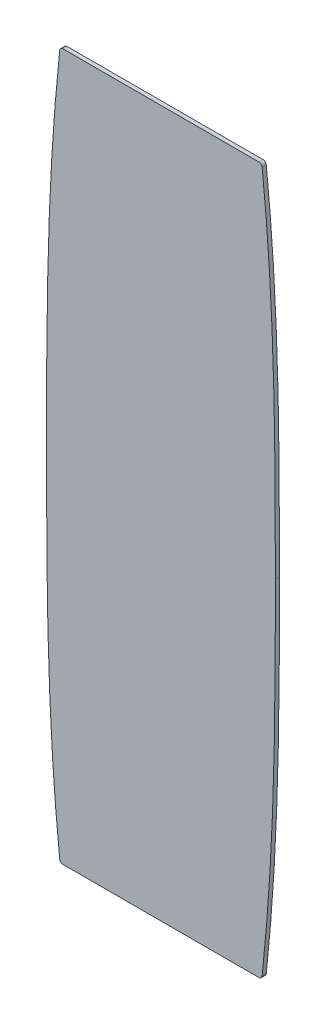
ISO-10303-21;
HEADER;
FILE_DESCRIPTION(('STEP AP214'),'2;1');
FILE_NAME('part.step','',(''),(''),'','','');
FILE_SCHEMA(('AUTOMOTIVE_DESIGN { 1 0 10303 214 1 1 1 1 }'));
ENDSEC;
DATA;
#1=APPLICATION_CONTEXT('core data for automotive mechanical design processes');
#2=APPLICATION_PROTOCOL_DEFINITION('international standard','automotive_design',2000,#1);
#3=PRODUCT_CONTEXT('',#1,'mechanical');
#4=PRODUCT('Part','Part','',(#3));
#5=PRODUCT_RELATED_PRODUCT_CATEGORY('part','',(#4));
#6=PRODUCT_DEFINITION_FORMATION('','',#4);
#7=PRODUCT_DEFINITION_CONTEXT('part definition',#1,'design');
#8=PRODUCT_DEFINITION('design','',#6,#7);
#9=PRODUCT_DEFINITION_SHAPE('','',#8);
#10=(LENGTH_UNIT() NAMED_UNIT(*) SI_UNIT(.MILLI.,.METRE.));
#11=(NAMED_UNIT(*) PLANE_ANGLE_UNIT() SI_UNIT($,.RADIAN.));
#12=(NAMED_UNIT(*) SI_UNIT($,.STERADIAN.) SOLID_ANGLE_UNIT());
#13=UNCERTAINTY_MEASURE_WITH_UNIT(LENGTH_MEASURE(1.E-05),#10,'distance_accuracy_value','');
#14=(GEOMETRIC_REPRESENTATION_CONTEXT(3) GLOBAL_UNCERTAINTY_ASSIGNED_CONTEXT((#13)) GLOBAL_UNIT_ASSIGNED_CONTEXT((#10,
#11,#12)) REPRESENTATION_CONTEXT('',''));
#15=CARTESIAN_POINT('',(0.,0.,0.));
#16=DIRECTION('',(0.,0.,1.));
#17=DIRECTION('',(1.,0.,0.));
#18=AXIS2_PLACEMENT_3D('',#15,#16,#17);
#19=CARTESIAN_POINT('',(-23.7958865539452,84.9999999999942,181.382704298413));
#20=DIRECTION('',(0.,0.,-1.));
#21=DIRECTION('',(-1.,0.,0.));
#22=AXIS2_PLACEMENT_3D('',#19,#20,#21);
#23=CYLINDRICAL_SURFACE('',#22,0.800000019336901);
#24=CARTESIAN_POINT('',(-23.7958865539452,84.9999999999942,1.));
#25=DIRECTION('',(0.,0.,1.));
#26=DIRECTION('',(0.,-1.,0.));
#27=AXIS2_PLACEMENT_3D('',#24,#25,#26);
#28=CIRCLE('',#27,0.800000019336901);
#29=CARTESIAN_POINT('',(-23.7958865539452,85.8000000193311,1.));
#30=VERTEX_POINT('',#29);
#31=CARTESIAN_POINT('',(-24.5914102098078,85.0845112057723,1.));
#32=VERTEX_POINT('',#31);
#33=EDGE_CURVE('E170',#30,#32,#28,.T.);
#34=ORIENTED_EDGE('',*,*,#33,.F.);
#35=DIRECTION('',(0.,0.,-1.));
#36=VECTOR('',#35,1.);
#37=CARTESIAN_POINT('',(-23.7958865539452,85.8000000193311,181.382704298413));
#38=LINE('',#37,#36);
#39=CARTESIAN_POINT('',(-23.7958865539452,85.8000000193311,0.));
#40=VERTEX_POINT('',#39);
#41=EDGE_CURVE('E51',#30,#40,#38,.T.);
#42=ORIENTED_EDGE('',*,*,#41,.T.);
#43=CARTESIAN_POINT('',(-23.7958865539452,84.9999999999942,0.));
#44=DIRECTION('',(0.,0.,1.));
#45=DIRECTION('',(1.,0.,0.));
#46=AXIS2_PLACEMENT_3D('',#43,#44,#45);
#47=CIRCLE('',#46,0.800000019336901);
#48=CARTESIAN_POINT('',(-24.5914102098078,85.0845112057723,0.));
#49=VERTEX_POINT('',#48);
#50=EDGE_CURVE('E188',#40,#49,#47,.T.);
#51=ORIENTED_EDGE('',*,*,#50,.T.);
#52=DIRECTION('',(0.,0.,-1.));
#53=VECTOR('',#52,1.);
#54=CARTESIAN_POINT('',(-24.5914102098078,85.0845112057723,181.382704298413));
#55=LINE('',#54,#53);
#56=EDGE_CURVE('E98',#32,#49,#55,.T.);
#57=ORIENTED_EDGE('',*,*,#56,.F.);
#58=EDGE_LOOP('',(#34,#42,#51,#57));
#59=FACE_BOUND('',#58,.T.);
#60=ADVANCED_FACE('F34',(#59),#23,.T.);
#61=CARTESIAN_POINT('',(-24.5914102098078,85.0845112057723,181.382704298413));
#62=CARTESIAN_POINT('',(-25.3414681276743,78.0240413966324,181.382704298413));
#63=CARTESIAN_POINT('',(-25.9324082653238,70.9501614117569,181.382704298413));
#64=CARTESIAN_POINT('',(-26.8286647670238,56.7783295564312,181.382704298413));
#65=CARTESIAN_POINT('',(-27.1350808962299,49.6859758030988,181.382704298413));
#66=CARTESIAN_POINT('',(-27.5517906477118,35.4924420710763,181.382704298413));
#67=CARTESIAN_POINT('',(-27.6629653106892,28.3945951645525,181.382704298413));
#68=CARTESIAN_POINT('',(-27.7874467113789,14.1978959260184,181.382704298413));
#69=CARTESIAN_POINT('',(-27.799999999994,7.09901507020539,181.382704298413));
#70=CARTESIAN_POINT('',(-27.8000000000003,2.14068117293803E-12,181.382704298413));
#71=B_SPLINE_CURVE_WITH_KNOTS('',3,(#61,#62,#63,#64,#65,#66,#67,#68,#69,#70),.UNSPECIFIED.,.F.,
.F.,(4,2,2,2,4),(0.,0.25,0.5,0.75,1.),.UNSPECIFIED.);
#72=DIRECTION('',(0.,0.,-1.));
#73=VECTOR('',#72,1.);
#74=SURFACE_OF_LINEAR_EXTRUSION('',#71,#73);
#75=CARTESIAN_POINT('',(-24.5914102098078,85.0845112057723,1.));
#76=CARTESIAN_POINT('',(-25.3414681276743,78.0240413966324,1.));
#77=CARTESIAN_POINT('',(-25.9324082653238,70.9501614117569,1.));
#78=CARTESIAN_POINT('',(-26.8286647670238,56.7783295564312,1.));
#79=CARTESIAN_POINT('',(-27.1350808962299,49.6859758030988,1.));
#80=CARTESIAN_POINT('',(-27.5517906477118,35.4924420710763,1.));
#81=CARTESIAN_POINT('',(-27.6629653106892,28.3945951645525,1.));
#82=CARTESIAN_POINT('',(-27.7874467113789,14.1978959260184,1.));
#83=CARTESIAN_POINT('',(-27.799999999994,7.09901507020539,1.));
#84=CARTESIAN_POINT('',(-27.8000000000003,2.14068117293803E-12,1.));
#85=B_SPLINE_CURVE_WITH_KNOTS('',3,(#75,#76,#77,#78,#79,#80,#81,#82,#83,#84),.UNSPECIFIED.,.F.,
.F.,(4,2,2,2,4),(0.,0.25,0.5,0.75,1.),.UNSPECIFIED.);
#86=CARTESIAN_POINT('',(-27.8000000000003,2.31890728044732E-12,1.));
#87=VERTEX_POINT('',#86);
#88=EDGE_CURVE('E105',#32,#87,#85,.T.);
#89=ORIENTED_EDGE('',*,*,#88,.F.);
#90=ORIENTED_EDGE('',*,*,#56,.T.);
#91=CARTESIAN_POINT('',(-24.5914102098078,85.0845112057723,0.));
#92=CARTESIAN_POINT('',(-25.3414681276743,78.0240413966324,0.));
#93=CARTESIAN_POINT('',(-25.9324082653238,70.9501614117569,0.));
#94=CARTESIAN_POINT('',(-26.8286647670238,56.7783295564312,0.));
#95=CARTESIAN_POINT('',(-27.1350808962299,49.6859758030988,0.));
#96=CARTESIAN_POINT('',(-27.5517906477118,35.4924420710763,0.));
#97=CARTESIAN_POINT('',(-27.6629653106892,28.3945951645525,0.));
#98=CARTESIAN_POINT('',(-27.7874467113789,14.1978959260184,0.));
#99=CARTESIAN_POINT('',(-27.799999999994,7.09901507020539,0.));
#100=CARTESIAN_POINT('',(-27.8000000000003,2.14068117293803E-12,0.));
#101=B_SPLINE_CURVE_WITH_KNOTS('',3,(#91,#92,#93,#94,#95,#96,#97,#98,#99,#100),.UNSPECIFIED.,
.F.,.F.,(4,2,2,2,4),(0.,0.25,0.5,0.75,1.),.UNSPECIFIED.);
#102=CARTESIAN_POINT('',(-27.8000000000003,2.31890728044732E-12,0.));
#103=VERTEX_POINT('',#102);
#104=EDGE_CURVE('E318',#49,#103,#101,.T.);
#105=ORIENTED_EDGE('',*,*,#104,.T.);
#106=DIRECTION('',(0.,0.,-1.));
#107=VECTOR('',#106,1.);
#108=CARTESIAN_POINT('',(-27.8000000000003,2.31890728044732E-12,181.382704298413));
#109=LINE('',#108,#107);
#110=EDGE_CURVE('E319',#87,#103,#109,.T.);
#111=ORIENTED_EDGE('',*,*,#110,.F.);
#112=EDGE_LOOP('',(#89,#90,#105,#111));
#113=FACE_BOUND('',#112,.T.);
#114=ADVANCED_FACE('F294',(#113),#74,.F.);
#115=CARTESIAN_POINT('',(-27.8000000000003,2.31890728044732E-12,181.382704298413));
#116=CARTESIAN_POINT('',(-27.8000000000003,-7.10026337369664,181.382704298413));
#117=CARTESIAN_POINT('',(-27.78744572717,-14.2004825594476,181.382704298413));
#118=CARTESIAN_POINT('',(-27.6628922700786,-28.4005709093567,181.382704298413));
#119=CARTESIAN_POINT('',(-27.5516144968244,-35.4997378019527,181.382704298413));
#120=CARTESIAN_POINT('',(-27.1347605951349,-49.6945749648577,181.382704298413));
#121=CARTESIAN_POINT('',(-26.8272735731577,-56.7856202919214,181.382704298413));
#122=CARTESIAN_POINT('',(-26.1559461025129,-67.4085360047461,181.382704298413));
#123=CARTESIAN_POINT('',(-25.8975416390131,-70.9472635242826,181.382704298413));
#124=CARTESIAN_POINT('',(-25.3027242818623,-78.0196626059068,181.382704298413));
#125=CARTESIAN_POINT('',(-24.9665380475483,-81.5533488584577,181.382704298413));
#126=CARTESIAN_POINT('',(-24.5914105301415,-85.0845112110924,181.382704298413));
#127=B_SPLINE_CURVE_WITH_KNOTS('',3,(#115,#116,#117,#118,#119,#120,#121,#122,#123,#124,#125,
#126),.UNSPECIFIED.,.F.,.F.,(4,2,2,2,2,4),(0.,0.25,0.5,0.75,0.875,1.),.UNSPECIFIED.);
#128=DIRECTION('',(0.,0.,-1.));
#129=VECTOR('',#128,1.);
#130=SURFACE_OF_LINEAR_EXTRUSION('',#127,#129);
#131=CARTESIAN_POINT('',(-27.8000000000003,2.31890728044732E-12,1.));
#132=CARTESIAN_POINT('',(-27.8000000000003,-7.10026337369664,1.));
#133=CARTESIAN_POINT('',(-27.78744572717,-14.2004825594476,1.));
#134=CARTESIAN_POINT('',(-27.6628922700786,-28.4005709093567,1.));
#135=CARTESIAN_POINT('',(-27.5516144968244,-35.4997378019527,1.));
#136=CARTESIAN_POINT('',(-27.1347605951349,-49.6945749648577,1.));
#137=CARTESIAN_POINT('',(-26.8272735731577,-56.7856202919214,1.));
#138=CARTESIAN_POINT('',(-26.1559461025129,-67.4085360047461,1.));
#139=CARTESIAN_POINT('',(-25.8975416390131,-70.9472635242826,1.));
#140=CARTESIAN_POINT('',(-25.3027242818623,-78.0196626059068,1.));
#141=CARTESIAN_POINT('',(-24.9665380475483,-81.5533488584577,1.));
#142=CARTESIAN_POINT('',(-24.5914105301415,-85.0845112110924,1.));
#143=B_SPLINE_CURVE_WITH_KNOTS('',3,(#131,#132,#133,#134,#135,#136,#137,#138,#139,#140,#141,
#142),.UNSPECIFIED.,.F.,.F.,(4,2,2,2,2,4),(0.,0.25,0.5,0.75,0.875,1.),.UNSPECIFIED.);
#144=CARTESIAN_POINT('',(-24.5914105203034,-85.0845112100473,1.));
#145=VERTEX_POINT('',#144);
#146=EDGE_CURVE('E159',#87,#145,#143,.T.);
#147=ORIENTED_EDGE('',*,*,#146,.F.);
#148=ORIENTED_EDGE('',*,*,#110,.T.);
#149=CARTESIAN_POINT('',(-27.8000000000003,2.31890728044732E-12,0.));
#150=CARTESIAN_POINT('',(-27.8000000000003,-7.10026337369664,0.));
#151=CARTESIAN_POINT('',(-27.78744572717,-14.2004825594476,0.));
#152=CARTESIAN_POINT('',(-27.6628922700786,-28.4005709093567,0.));
#153=CARTESIAN_POINT('',(-27.5516144968244,-35.4997378019527,0.));
#154=CARTESIAN_POINT('',(-27.1347605951349,-49.6945749648577,0.));
#155=CARTESIAN_POINT('',(-26.8272735731577,-56.7856202919214,0.));
#156=CARTESIAN_POINT('',(-26.1559461025129,-67.4085360047461,0.));
#157=CARTESIAN_POINT('',(-25.8975416390131,-70.9472635242826,0.));
#158=CARTESIAN_POINT('',(-25.3027242818623,-78.0196626059068,0.));
#159=CARTESIAN_POINT('',(-24.9665380475483,-81.5533488584577,0.));
#160=CARTESIAN_POINT('',(-24.5914105301415,-85.0845112110924,0.));
#161=B_SPLINE_CURVE_WITH_KNOTS('',3,(#149,#150,#151,#152,#153,#154,#155,#156,#157,#158,#159,
#160),.UNSPECIFIED.,.F.,.F.,(4,2,2,2,2,4),(0.,0.25,0.5,0.75,0.875,1.),.UNSPECIFIED.);
#162=CARTESIAN_POINT('',(-24.5914105203034,-85.0845112100473,0.));
#163=VERTEX_POINT('',#162);
#164=EDGE_CURVE('E279',#103,#163,#161,.T.);
#165=ORIENTED_EDGE('',*,*,#164,.T.);
#166=DIRECTION('',(0.,0.,-1.));
#167=VECTOR('',#166,1.);
#168=CARTESIAN_POINT('',(-24.5914105203034,-85.0845112100473,181.382704298413));
#169=LINE('',#168,#167);
#170=EDGE_CURVE('E321',#145,#163,#169,.T.);
#171=ORIENTED_EDGE('',*,*,#170,.F.);
#172=EDGE_LOOP('',(#147,#148,#165,#171));
#173=FACE_BOUND('',#172,.T.);
#174=ADVANCED_FACE('F283',(#173),#130,.F.);
#175=CARTESIAN_POINT('',(-23.7958868942765,-85.0000000001192,181.382704298413));
#176=DIRECTION('',(0.,0.,-1.));
#177=DIRECTION('',(-1.,0.,0.));
#178=AXIS2_PLACEMENT_3D('',#175,#176,#177);
#179=CYLINDRICAL_SURFACE('',#178,0.799999990106502);
#180=CARTESIAN_POINT('',(-23.7958868942765,-85.0000000001192,1.));
#181=DIRECTION('',(0.,0.,1.));
#182=DIRECTION('',(0.,-1.,0.));
#183=AXIS2_PLACEMENT_3D('',#180,#181,#182);
#184=CIRCLE('',#183,0.799999990106502);
#185=CARTESIAN_POINT('',(-23.7958868942765,-85.7999999803322,1.));
#186=VERTEX_POINT('',#185);
#187=EDGE_CURVE('E156',#145,#186,#184,.T.);
#188=ORIENTED_EDGE('',*,*,#187,.F.);
#189=ORIENTED_EDGE('',*,*,#170,.T.);
#190=CARTESIAN_POINT('',(-23.7958868942765,-85.0000000001192,0.));
#191=DIRECTION('',(0.,0.,1.));
#192=DIRECTION('',(1.,0.,0.));
#193=AXIS2_PLACEMENT_3D('',#190,#191,#192);
#194=CIRCLE('',#193,0.799999990106502);
#195=CARTESIAN_POINT('',(-23.7958868942765,-85.7999999803322,0.));
#196=VERTEX_POINT('',#195);
#197=EDGE_CURVE('E182',#163,#196,#194,.T.);
#198=ORIENTED_EDGE('',*,*,#197,.T.);
#199=DIRECTION('',(0.,0.,-1.));
#200=VECTOR('',#199,1.);
#201=CARTESIAN_POINT('',(-23.7958868942765,-85.7999999803322,181.382704298413));
#202=LINE('',#201,#200);
#203=EDGE_CURVE('E179',#186,#196,#202,.T.);
#204=ORIENTED_EDGE('',*,*,#203,.F.);
#205=EDGE_LOOP('',(#188,#189,#198,#204));
#206=FACE_BOUND('',#205,.T.);
#207=ADVANCED_FACE('F293',(#206),#179,.T.);
#208=CARTESIAN_POINT('',(-23.7958868942765,-85.7999999803322,181.382704298413));
#209=DIRECTION('',(4.15773410230667E-10,1.,0.));
#210=DIRECTION('',(-1.,4.15773410230667E-10,0.));
#211=AXIS2_PLACEMENT_3D('',#208,#209,#210);
#212=PLANE('',#211);
#213=DIRECTION('',(1.,-4.15773410230667E-10,0.));
#214=VECTOR('',#213,1.);
#215=CARTESIAN_POINT('',(-23.7958868942765,-85.7999999803322,1.));
#216=LINE('',#215,#214);
#217=CARTESIAN_POINT('',(23.7958865541839,-85.8000000097881,1.));
#218=VERTEX_POINT('',#217);
#219=EDGE_CURVE('E153',#186,#218,#216,.T.);
#220=ORIENTED_EDGE('',*,*,#219,.F.);
#221=ORIENTED_EDGE('',*,*,#203,.T.);
#222=DIRECTION('',(1.,-4.15773410230667E-10,0.));
#223=VECTOR('',#222,1.);
#224=CARTESIAN_POINT('',(-23.7958868942765,-85.7999999803322,0.));
#225=LINE('',#224,#223);
#226=CARTESIAN_POINT('',(23.7958865541839,-85.8000000097881,0.));
#227=VERTEX_POINT('',#226);
#228=EDGE_CURVE('E181',#196,#227,#225,.T.);
#229=ORIENTED_EDGE('',*,*,#228,.T.);
#230=DIRECTION('',(0.,0.,-1.));
#231=VECTOR('',#230,1.);
#232=CARTESIAN_POINT('',(23.7958865541839,-85.8000000097881,181.382704298413));
#233=LINE('',#232,#231);
#234=EDGE_CURVE('E183',#218,#227,#233,.T.);
#235=ORIENTED_EDGE('',*,*,#234,.F.);
#236=EDGE_LOOP('',(#220,#221,#229,#235));
#237=FACE_BOUND('',#236,.T.);
#238=ADVANCED_FACE('F225',(#237),#212,.F.);
#239=CARTESIAN_POINT('',(23.7958865541839,-85.0000000001196,181.382704298413));
#240=DIRECTION('',(0.,0.,-1.));
#241=DIRECTION('',(-1.,0.,0.));
#242=AXIS2_PLACEMENT_3D('',#239,#240,#241);
#243=CYLINDRICAL_SURFACE('',#242,0.800000009668484);
#244=CARTESIAN_POINT('',(23.7958865541839,-85.0000000001196,1.));
#245=DIRECTION('',(0.,0.,1.));
#246=DIRECTION('',(0.,-1.,0.));
#247=AXIS2_PLACEMENT_3D('',#244,#245,#246);
#248=CIRCLE('',#247,0.800000009668484);
#249=CARTESIAN_POINT('',(24.5914102100467,-85.0845112058967,1.));
#250=VERTEX_POINT('',#249);
#251=EDGE_CURVE('E138',#218,#250,#248,.T.);
#252=ORIENTED_EDGE('',*,*,#251,.F.);
#253=ORIENTED_EDGE('',*,*,#234,.T.);
#254=CARTESIAN_POINT('',(23.7958865541839,-85.0000000001196,0.));
#255=DIRECTION('',(0.,0.,1.));
#256=DIRECTION('',(1.,0.,0.));
#257=AXIS2_PLACEMENT_3D('',#254,#255,#256);
#258=CIRCLE('',#257,0.800000009668484);
#259=CARTESIAN_POINT('',(24.5914102100467,-85.0845112058967,0.));
#260=VERTEX_POINT('',#259);
#261=EDGE_CURVE('E185',#227,#260,#258,.T.);
#262=ORIENTED_EDGE('',*,*,#261,.T.);
#263=DIRECTION('',(0.,0.,-1.));
#264=VECTOR('',#263,1.);
#265=CARTESIAN_POINT('',(24.5914102100467,-85.0845112058967,181.382704298413));
#266=LINE('',#265,#264);
#267=EDGE_CURVE('E239',#250,#260,#266,.T.);
#268=ORIENTED_EDGE('',*,*,#267,.F.);
#269=EDGE_LOOP('',(#252,#253,#262,#268));
#270=FACE_BOUND('',#269,.T.);
#271=ADVANCED_FACE('F378',(#270),#243,.T.);
#272=CARTESIAN_POINT('',(24.5914102100467,-85.0845112058967,181.382704298413));
#273=CARTESIAN_POINT('',(25.341468127906,-78.0240413967456,181.382704298413));
#274=CARTESIAN_POINT('',(25.9324082655476,-70.950161411859,181.382704298413));
#275=CARTESIAN_POINT('',(26.828664767231,-56.7783295565113,181.382704298413));
#276=CARTESIAN_POINT('',(27.1350808964282,-49.6859758031681,181.382704298413));
#277=CARTESIAN_POINT('',(27.5517906478913,-35.4924420711242,181.382704298413));
#278=CARTESIAN_POINT('',(27.6629653108589,-28.3945951645898,181.382704298413));
#279=CARTESIAN_POINT('',(27.7874467115286,-14.1978959260347,181.382704298413));
#280=CARTESIAN_POINT('',(27.8000000001335,-7.09901507021146,181.382704298413));
#281=CARTESIAN_POINT('',(27.8000000001295,2.20557032860687E-12,181.382704298413));
#282=B_SPLINE_CURVE_WITH_KNOTS('',3,(#272,#273,#274,#275,#276,#277,#278,#279,#280,#281),
.UNSPECIFIED.,.F.,.F.,(4,2,2,2,4),(0.,0.25,0.5,0.75,1.),.UNSPECIFIED.);
#283=DIRECTION('',(0.,0.,-1.));
#284=VECTOR('',#283,1.);
#285=SURFACE_OF_LINEAR_EXTRUSION('',#282,#284);
#286=CARTESIAN_POINT('',(24.5914102100467,-85.0845112058967,1.));
#287=CARTESIAN_POINT('',(25.341468127906,-78.0240413967456,1.));
#288=CARTESIAN_POINT('',(25.9324082655476,-70.950161411859,1.));
#289=CARTESIAN_POINT('',(26.828664767231,-56.7783295565113,1.));
#290=CARTESIAN_POINT('',(27.1350808964282,-49.6859758031681,1.));
#291=CARTESIAN_POINT('',(27.5517906478913,-35.4924420711242,1.));
#292=CARTESIAN_POINT('',(27.6629653108589,-28.3945951645898,1.));
#293=CARTESIAN_POINT('',(27.7874467115286,-14.1978959260347,1.));
#294=CARTESIAN_POINT('',(27.8000000001335,-7.09901507021146,1.));
#295=CARTESIAN_POINT('',(27.8000000001295,2.20557032860687E-12,1.));
#296=B_SPLINE_CURVE_WITH_KNOTS('',3,(#286,#287,#288,#289,#290,#291,#292,#293,#294,#295),
.UNSPECIFIED.,.F.,.F.,(4,2,2,2,4),(0.,0.25,0.5,0.75,1.),.UNSPECIFIED.);
#297=CARTESIAN_POINT('',(27.8000000001295,2.20557032860687E-12,1.));
#298=VERTEX_POINT('',#297);
#299=EDGE_CURVE('E136',#250,#298,#296,.T.);
#300=ORIENTED_EDGE('',*,*,#299,.F.);
#301=ORIENTED_EDGE('',*,*,#267,.T.);
#302=CARTESIAN_POINT('',(24.5914102100467,-85.0845112058967,0.));
#303=CARTESIAN_POINT('',(25.341468127906,-78.0240413967456,0.));
#304=CARTESIAN_POINT('',(25.9324082655476,-70.950161411859,0.));
#305=CARTESIAN_POINT('',(26.828664767231,-56.7783295565113,0.));
#306=CARTESIAN_POINT('',(27.1350808964282,-49.6859758031681,0.));
#307=CARTESIAN_POINT('',(27.5517906478913,-35.4924420711242,0.));
#308=CARTESIAN_POINT('',(27.6629653108589,-28.3945951645898,0.));
#309=CARTESIAN_POINT('',(27.7874467115286,-14.1978959260347,0.));
#310=CARTESIAN_POINT('',(27.8000000001335,-7.09901507021146,0.));
#311=CARTESIAN_POINT('',(27.8000000001295,2.20557032860687E-12,0.));
#312=B_SPLINE_CURVE_WITH_KNOTS('',3,(#302,#303,#304,#305,#306,#307,#308,#309,#310,#311),
.UNSPECIFIED.,.F.,.F.,(4,2,2,2,4),(0.,0.25,0.5,0.75,1.),.UNSPECIFIED.);
#313=CARTESIAN_POINT('',(27.8000000001295,2.20557032860687E-12,0.));
#314=VERTEX_POINT('',#313);
#315=EDGE_CURVE('E235',#260,#314,#312,.T.);
#316=ORIENTED_EDGE('',*,*,#315,.T.);
#317=DIRECTION('',(0.,0.,-1.));
#318=VECTOR('',#317,1.);
#319=CARTESIAN_POINT('',(27.8000000001295,2.20557032860687E-12,181.382704298413));
#320=LINE('',#319,#318);
#321=EDGE_CURVE('E327',#298,#314,#320,.T.);
#322=ORIENTED_EDGE('',*,*,#321,.F.);
#323=EDGE_LOOP('',(#300,#301,#316,#322));
#324=FACE_BOUND('',#323,.T.);
#325=ADVANCED_FACE('F205',(#324),#285,.F.);
#326=CARTESIAN_POINT('',(27.8000000001295,2.20557032860687E-12,181.382704298413));
#327=CARTESIAN_POINT('',(27.8000000001188,7.10026337369078,181.382704298413));
#328=CARTESIAN_POINT('',(27.7874457272779,14.2004825594314,181.382704298413));
#329=CARTESIAN_POINT('',(27.6628922701656,28.4005709093195,181.382704298413));
#330=CARTESIAN_POINT('',(27.5516144969013,35.4997378019049,181.382704298413));
#331=CARTESIAN_POINT('',(27.1347605951922,49.6945749647886,181.382704298413));
#332=CARTESIAN_POINT('',(26.8272735732056,56.7856202918415,181.382704298413));
#333=CARTESIAN_POINT('',(26.1559461025476,67.4085360046498,181.382704298413));
#334=CARTESIAN_POINT('',(25.8975416390436,70.9472635241808,181.382704298413));
#335=CARTESIAN_POINT('',(25.3027242818846,78.0196626057939,181.382704298413));
#336=CARTESIAN_POINT('',(24.9665380475667,81.5533488583392,181.382704298413));
#337=CARTESIAN_POINT('',(24.591410530156,85.0845112109683,181.382704298413));
#338=B_SPLINE_CURVE_WITH_KNOTS('',3,(#326,#327,#328,#329,#330,#331,#332,#333,#334,#335,#336,
#337),.UNSPECIFIED.,.F.,.F.,(4,2,2,2,2,4),(0.,0.25,0.5,0.75,0.875,1.),.UNSPECIFIED.);
#339=DIRECTION('',(0.,0.,-1.));
#340=VECTOR('',#339,1.);
#341=SURFACE_OF_LINEAR_EXTRUSION('',#338,#340);
#342=CARTESIAN_POINT('',(27.8000000001295,2.20557032860687E-12,1.));
#343=CARTESIAN_POINT('',(27.8000000001188,7.10026337369078,1.));
#344=CARTESIAN_POINT('',(27.7874457272779,14.2004825594314,1.));
#345=CARTESIAN_POINT('',(27.6628922701656,28.4005709093195,1.));
#346=CARTESIAN_POINT('',(27.5516144969013,35.4997378019049,1.));
#347=CARTESIAN_POINT('',(27.1347605951922,49.6945749647886,1.));
#348=CARTESIAN_POINT('',(26.8272735732056,56.7856202918415,1.));
#349=CARTESIAN_POINT('',(26.1559461025476,67.4085360046498,1.));
#350=CARTESIAN_POINT('',(25.8975416390436,70.9472635241808,1.));
#351=CARTESIAN_POINT('',(25.3027242818846,78.0196626057939,1.));
#352=CARTESIAN_POINT('',(24.9665380475667,81.5533488583392,1.));
#353=CARTESIAN_POINT('',(24.591410530156,85.0845112109683,1.));
#354=B_SPLINE_CURVE_WITH_KNOTS('',3,(#342,#343,#344,#345,#346,#347,#348,#349,#350,#351,#352,
#353),.UNSPECIFIED.,.F.,.F.,(4,2,2,2,2,4),(0.,0.25,0.5,0.75,0.875,1.),.UNSPECIFIED.);
#355=CARTESIAN_POINT('',(24.5914105203179,85.0845112099231,1.));
#356=VERTEX_POINT('',#355);
#357=EDGE_CURVE('E43',#298,#356,#354,.T.);
#358=ORIENTED_EDGE('',*,*,#357,.F.);
#359=ORIENTED_EDGE('',*,*,#321,.T.);
#360=CARTESIAN_POINT('',(27.8000000001295,2.20557032860687E-12,0.));
#361=CARTESIAN_POINT('',(27.8000000001188,7.10026337369078,0.));
#362=CARTESIAN_POINT('',(27.7874457272779,14.2004825594314,0.));
#363=CARTESIAN_POINT('',(27.6628922701656,28.4005709093195,0.));
#364=CARTESIAN_POINT('',(27.5516144969013,35.4997378019049,0.));
#365=CARTESIAN_POINT('',(27.1347605951922,49.6945749647886,0.));
#366=CARTESIAN_POINT('',(26.8272735732056,56.7856202918415,0.));
#367=CARTESIAN_POINT('',(26.1559461025476,67.4085360046498,0.));
#368=CARTESIAN_POINT('',(25.8975416390436,70.9472635241808,0.));
#369=CARTESIAN_POINT('',(25.3027242818846,78.0196626057939,0.));
#370=CARTESIAN_POINT('',(24.9665380475667,81.5533488583392,0.));
#371=CARTESIAN_POINT('',(24.591410530156,85.0845112109683,0.));
#372=B_SPLINE_CURVE_WITH_KNOTS('',3,(#360,#361,#362,#363,#364,#365,#366,#367,#368,#369,#370,
#371),.UNSPECIFIED.,.F.,.F.,(4,2,2,2,2,4),(0.,0.25,0.5,0.75,0.875,1.),.UNSPECIFIED.);
#373=CARTESIAN_POINT('',(24.5914105203179,85.0845112099231,0.));
#374=VERTEX_POINT('',#373);
#375=EDGE_CURVE('E129',#314,#374,#372,.T.);
#376=ORIENTED_EDGE('',*,*,#375,.T.);
#377=DIRECTION('',(0.,0.,-1.));
#378=VECTOR('',#377,1.);
#379=CARTESIAN_POINT('',(24.5914105203179,85.0845112099231,181.382704298413));
#380=LINE('',#379,#378);
#381=EDGE_CURVE('E120',#356,#374,#380,.T.);
#382=ORIENTED_EDGE('',*,*,#381,.F.);
#383=EDGE_LOOP('',(#358,#359,#376,#382));
#384=FACE_BOUND('',#383,.T.);
#385=ADVANCED_FACE('F126',(#384),#341,.F.);
#386=CARTESIAN_POINT('',(23.7958868942912,84.9999999999942,181.382704298413));
#387=DIRECTION('',(0.,0.,-1.));
#388=DIRECTION('',(-1.,0.,0.));
#389=AXIS2_PLACEMENT_3D('',#386,#387,#388);
#390=CYLINDRICAL_SURFACE('',#389,0.799999990106489);
#391=CARTESIAN_POINT('',(23.7958868942912,84.9999999999942,1.));
#392=DIRECTION('',(0.,0.,1.));
#393=DIRECTION('',(0.,-1.,0.));
#394=AXIS2_PLACEMENT_3D('',#391,#392,#393);
#395=CIRCLE('',#394,0.799999990106489);
#396=CARTESIAN_POINT('',(23.7958868942912,85.7999999802072,1.));
#397=VERTEX_POINT('',#396);
#398=EDGE_CURVE('E11',#356,#397,#395,.T.);
#399=ORIENTED_EDGE('',*,*,#398,.F.);
#400=ORIENTED_EDGE('',*,*,#381,.T.);
#401=CARTESIAN_POINT('',(23.7958868942912,84.9999999999942,0.));
#402=DIRECTION('',(0.,0.,1.));
#403=DIRECTION('',(1.,0.,0.));
#404=AXIS2_PLACEMENT_3D('',#401,#402,#403);
#405=CIRCLE('',#404,0.799999990106489);
#406=CARTESIAN_POINT('',(23.7958868942912,85.7999999802072,0.));
#407=VERTEX_POINT('',#406);
#408=EDGE_CURVE('E132',#374,#407,#405,.T.);
#409=ORIENTED_EDGE('',*,*,#408,.T.);
#410=DIRECTION('',(0.,0.,-1.));
#411=VECTOR('',#410,1.);
#412=CARTESIAN_POINT('',(23.7958868942912,85.7999999802072,181.382704298413));
#413=LINE('',#412,#411);
#414=EDGE_CURVE('E57',#397,#407,#413,.T.);
#415=ORIENTED_EDGE('',*,*,#414,.F.);
#416=EDGE_LOOP('',(#399,#400,#409,#415));
#417=FACE_BOUND('',#416,.T.);
#418=ADVANCED_FACE('F119',(#417),#390,.T.);
#419=CARTESIAN_POINT('',(23.7958868942912,85.7999999802072,181.382704298413));
#420=DIRECTION('',(-8.22073593059617E-10,-1.,0.));
#421=DIRECTION('',(1.,-8.22073593059617E-10,0.));
#422=AXIS2_PLACEMENT_3D('',#419,#420,#421);
#423=PLANE('',#422);
#424=DIRECTION('',(-1.,8.22073593059617E-10,0.));
#425=VECTOR('',#424,1.);
#426=CARTESIAN_POINT('',(23.7958868942912,85.7999999802072,1.));
#427=LINE('',#426,#425);
#428=EDGE_CURVE('E176',#397,#30,#427,.T.);
#429=ORIENTED_EDGE('',*,*,#428,.F.);
#430=ORIENTED_EDGE('',*,*,#414,.T.);
#431=DIRECTION('',(-1.,8.22073593059617E-10,0.));
#432=VECTOR('',#431,1.);
#433=CARTESIAN_POINT('',(23.7958868942912,85.7999999802072,0.));
#434=LINE('',#433,#432);
#435=EDGE_CURVE('E178',#407,#40,#434,.T.);
#436=ORIENTED_EDGE('',*,*,#435,.T.);
#437=ORIENTED_EDGE('',*,*,#41,.F.);
#438=EDGE_LOOP('',(#429,#430,#436,#437));
#439=FACE_BOUND('',#438,.T.);
#440=ADVANCED_FACE('F257',(#439),#423,.F.);
#441=CARTESIAN_POINT('',(-23.7958865539452,84.9999999999942,0.));
#442=DIRECTION('',(0.,0.,1.));
#443=DIRECTION('',(1.,0.,0.));
#444=AXIS2_PLACEMENT_3D('',#441,#442,#443);
#445=PLANE('',#444);
#446=ORIENTED_EDGE('',*,*,#50,.F.);
#447=ORIENTED_EDGE('',*,*,#435,.F.);
#448=ORIENTED_EDGE('',*,*,#408,.F.);
#449=ORIENTED_EDGE('',*,*,#375,.F.);
#450=ORIENTED_EDGE('',*,*,#315,.F.);
#451=ORIENTED_EDGE('',*,*,#261,.F.);
#452=ORIENTED_EDGE('',*,*,#228,.F.);
#453=ORIENTED_EDGE('',*,*,#197,.F.);
#454=ORIENTED_EDGE('',*,*,#164,.F.);
#455=ORIENTED_EDGE('',*,*,#104,.F.);
#456=EDGE_LOOP('',(#446,#447,#448,#449,#450,#451,#452,#453,#454,#455));
#457=FACE_BOUND('',#456,.T.);
#458=ADVANCED_FACE('F233',(#457),#445,.F.);
#459=CARTESIAN_POINT('',(-78.0797582632697,72.9710233045197,1.));
#460=DIRECTION('',(0.,0.,1.));
#461=DIRECTION('',(0.,-1.,0.));
#462=AXIS2_PLACEMENT_3D('',#459,#460,#461);
#463=PLANE('',#462);
#464=ORIENTED_EDGE('',*,*,#428,.T.);
#465=ORIENTED_EDGE('',*,*,#33,.T.);
#466=ORIENTED_EDGE('',*,*,#88,.T.);
#467=ORIENTED_EDGE('',*,*,#146,.T.);
#468=ORIENTED_EDGE('',*,*,#187,.T.);
#469=ORIENTED_EDGE('',*,*,#219,.T.);
#470=ORIENTED_EDGE('',*,*,#251,.T.);
#471=ORIENTED_EDGE('',*,*,#299,.T.);
#472=ORIENTED_EDGE('',*,*,#357,.T.);
#473=ORIENTED_EDGE('',*,*,#398,.T.);
#474=EDGE_LOOP('',(#464,#465,#466,#467,#468,#469,#470,#471,#472,#473));
#475=FACE_BOUND('',#474,.T.);
#476=ADVANCED_FACE('F36',(#475),#463,.T.);
#477=CLOSED_SHELL('',(#60,#114,#174,#207,#238,#271,#325,#385,#418,#440,#458,#476));
#478=MANIFOLD_SOLID_BREP('B2',#477);
#479=ADVANCED_BREP_SHAPE_REPRESENTATION('',(#18,#478),#14);
#480=SHAPE_DEFINITION_REPRESENTATION(#9,#479);
ENDSEC;
END-ISO-10303-21;
